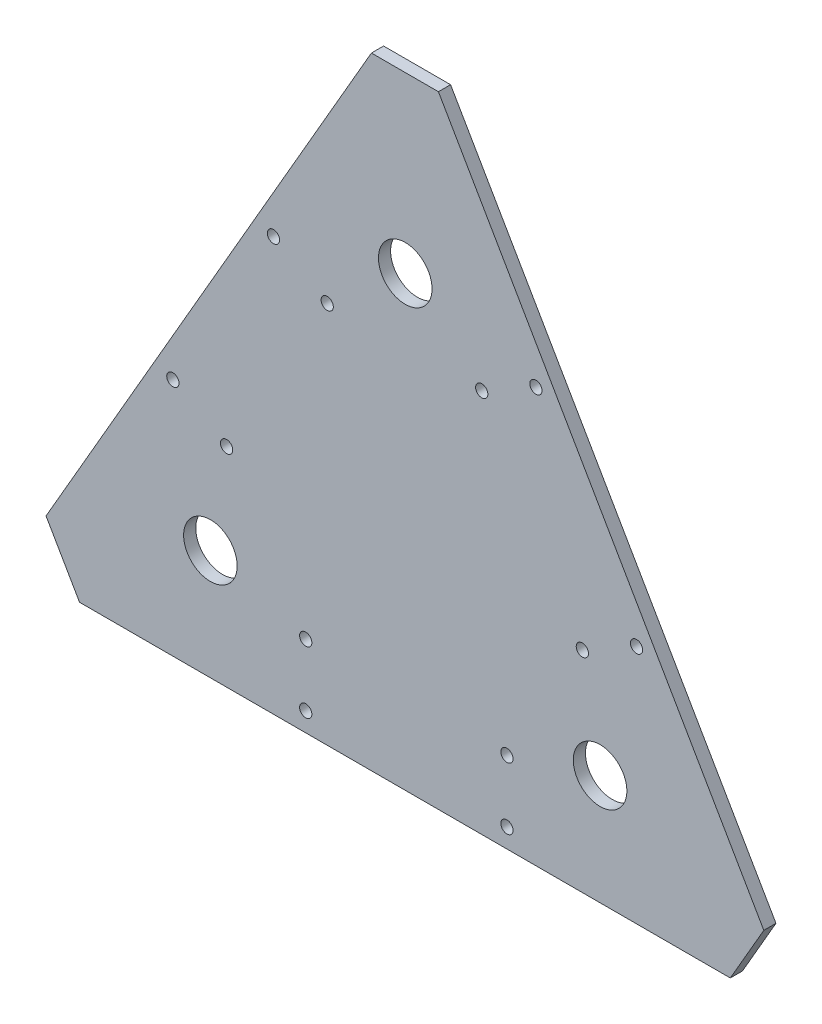
ISO-10303-21;
HEADER;
FILE_DESCRIPTION(('STEP AP214'),'2;1');
FILE_NAME('part.step','',(''),(''),'','','');
FILE_SCHEMA(('AUTOMOTIVE_DESIGN { 1 0 10303 214 1 1 1 1 }'));
ENDSEC;
DATA;
#1=APPLICATION_CONTEXT('core data for automotive mechanical design processes');
#2=APPLICATION_PROTOCOL_DEFINITION('international standard','automotive_design',2000,#1);
#3=PRODUCT_CONTEXT('',#1,'mechanical');
#4=PRODUCT('Part','Part','',(#3));
#5=PRODUCT_RELATED_PRODUCT_CATEGORY('part','',(#4));
#6=PRODUCT_DEFINITION_FORMATION('','',#4);
#7=PRODUCT_DEFINITION_CONTEXT('part definition',#1,'design');
#8=PRODUCT_DEFINITION('design','',#6,#7);
#9=PRODUCT_DEFINITION_SHAPE('','',#8);
#10=(LENGTH_UNIT() NAMED_UNIT(*) SI_UNIT(.MILLI.,.METRE.));
#11=(NAMED_UNIT(*) PLANE_ANGLE_UNIT() SI_UNIT($,.RADIAN.));
#12=(NAMED_UNIT(*) SI_UNIT($,.STERADIAN.) SOLID_ANGLE_UNIT());
#13=UNCERTAINTY_MEASURE_WITH_UNIT(LENGTH_MEASURE(1.E-05),#10,'distance_accuracy_value','');
#14=(GEOMETRIC_REPRESENTATION_CONTEXT(3) GLOBAL_UNCERTAINTY_ASSIGNED_CONTEXT((#13)) GLOBAL_UNIT_ASSIGNED_CONTEXT((#10,
#11,#12)) REPRESENTATION_CONTEXT('',''));
#15=CARTESIAN_POINT('',(0.,0.,0.));
#16=DIRECTION('',(0.,0.,1.));
#17=DIRECTION('',(1.,0.,0.));
#18=AXIS2_PLACEMENT_3D('',#15,#16,#17);
#19=CARTESIAN_POINT('',(-629.960250444117,-347.93042966675,-6.35));
#20=DIRECTION('',(-0.866025403784439,-0.499999999999999,0.));
#21=DIRECTION('',(0.499999999999999,-0.866025403784439,0.));
#22=AXIS2_PLACEMENT_3D('',#19,#20,#21);
#23=PLANE('',#22);
#24=DIRECTION('',(0.499999999999999,-0.866025403784439,0.));
#25=VECTOR('',#24,1.);
#26=CARTESIAN_POINT('',(-629.960250444117,-347.93042966675,0.));
#27=LINE('',#26,#25);
#28=CARTESIAN_POINT('',(-647.460250444117,-317.619540534295,0.));
#29=VERTEX_POINT('',#28);
#30=CARTESIAN_POINT('',(-629.960250444117,-347.93042966675,0.));
#31=VERTEX_POINT('',#30);
#32=EDGE_CURVE('E119',#29,#31,#27,.T.);
#33=ORIENTED_EDGE('',*,*,#32,.F.);
#34=DIRECTION('',(0.,0.,1.));
#35=VECTOR('',#34,1.);
#36=CARTESIAN_POINT('',(-647.460250444117,-317.619540534295,-6.35));
#37=LINE('',#36,#35);
#38=CARTESIAN_POINT('',(-647.460250444117,-317.619540534295,-6.35));
#39=VERTEX_POINT('',#38);
#40=EDGE_CURVE('E11',#39,#29,#37,.T.);
#41=ORIENTED_EDGE('',*,*,#40,.F.);
#42=DIRECTION('',(0.499999999999999,-0.866025403784439,0.));
#43=VECTOR('',#42,1.);
#44=CARTESIAN_POINT('',(-629.960250444117,-347.93042966675,-6.35));
#45=LINE('',#44,#43);
#46=CARTESIAN_POINT('',(-629.960250444117,-347.93042966675,-6.35));
#47=VERTEX_POINT('',#46);
#48=EDGE_CURVE('E134',#39,#47,#45,.T.);
#49=ORIENTED_EDGE('',*,*,#48,.T.);
#50=DIRECTION('',(0.,0.,1.));
#51=VECTOR('',#50,1.);
#52=CARTESIAN_POINT('',(-629.960250444117,-347.93042966675,-6.35));
#53=LINE('',#52,#51);
#54=EDGE_CURVE('E37',#47,#31,#53,.T.);
#55=ORIENTED_EDGE('',*,*,#54,.T.);
#56=EDGE_LOOP('',(#33,#41,#49,#55));
#57=FACE_BOUND('',#56,.T.);
#58=ADVANCED_FACE('F34',(#57),#23,.T.);
#59=CARTESIAN_POINT('',(-647.460250444117,-317.619540534295,-6.35));
#60=DIRECTION('',(-0.866025403784436,0.500000000000004,0.));
#61=DIRECTION('',(-0.500000000000004,-0.866025403784436,0.));
#62=AXIS2_PLACEMENT_3D('',#59,#60,#61);
#63=PLANE('',#62);
#64=DIRECTION('',(-0.500000000000004,-0.866025403784436,0.));
#65=VECTOR('',#64,1.);
#66=CARTESIAN_POINT('',(-647.460250444117,-317.619540534295,0.));
#67=LINE('',#66,#65);
#68=CARTESIAN_POINT('',(-477.475995613577,-23.1981746810674,0.));
#69=VERTEX_POINT('',#68);
#70=EDGE_CURVE('E132',#69,#29,#67,.T.);
#71=ORIENTED_EDGE('',*,*,#70,.F.);
#72=DIRECTION('',(0.,0.,1.));
#73=VECTOR('',#72,1.);
#74=CARTESIAN_POINT('',(-477.475995613577,-23.1981746810674,-6.35));
#75=LINE('',#74,#73);
#76=CARTESIAN_POINT('',(-477.475995613577,-23.1981746810674,-6.35));
#77=VERTEX_POINT('',#76);
#78=EDGE_CURVE('E43',#77,#69,#75,.T.);
#79=ORIENTED_EDGE('',*,*,#78,.F.);
#80=DIRECTION('',(-0.500000000000004,-0.866025403784436,0.));
#81=VECTOR('',#80,1.);
#82=CARTESIAN_POINT('',(-647.460250444117,-317.619540534295,-6.35));
#83=LINE('',#82,#81);
#84=EDGE_CURVE('E109',#77,#39,#83,.T.);
#85=ORIENTED_EDGE('',*,*,#84,.T.);
#86=ORIENTED_EDGE('',*,*,#40,.T.);
#87=EDGE_LOOP('',(#71,#79,#85,#86));
#88=FACE_BOUND('',#87,.T.);
#89=ADVANCED_FACE('F142',(#88),#63,.T.);
#90=CARTESIAN_POINT('',(-477.475995613577,-23.1981746810674,-6.35));
#91=DIRECTION('',(0.,1.,0.));
#92=DIRECTION('',(0.,0.,1.));
#93=AXIS2_PLACEMENT_3D('',#90,#91,#92);
#94=PLANE('',#93);
#95=DIRECTION('',(-1.,0.,0.));
#96=VECTOR('',#95,1.);
#97=CARTESIAN_POINT('',(-477.475995613577,-23.1981746810674,0.));
#98=LINE('',#97,#96);
#99=CARTESIAN_POINT('',(-442.475995613577,-23.1981746810674,0.));
#100=VERTEX_POINT('',#99);
#101=EDGE_CURVE('E96',#100,#69,#98,.T.);
#102=ORIENTED_EDGE('',*,*,#101,.F.);
#103=DIRECTION('',(0.,0.,1.));
#104=VECTOR('',#103,1.);
#105=CARTESIAN_POINT('',(-442.475995613577,-23.1981746810674,-6.35));
#106=LINE('',#105,#104);
#107=CARTESIAN_POINT('',(-442.475995613577,-23.1981746810674,-6.35));
#108=VERTEX_POINT('',#107);
#109=EDGE_CURVE('E91',#108,#100,#106,.T.);
#110=ORIENTED_EDGE('',*,*,#109,.F.);
#111=DIRECTION('',(-1.,0.,0.));
#112=VECTOR('',#111,1.);
#113=CARTESIAN_POINT('',(-477.475995613577,-23.1981746810674,-6.35));
#114=LINE('',#113,#112);
#115=EDGE_CURVE('E94',#108,#77,#114,.T.);
#116=ORIENTED_EDGE('',*,*,#115,.T.);
#117=ORIENTED_EDGE('',*,*,#78,.T.);
#118=EDGE_LOOP('',(#102,#110,#116,#117));
#119=FACE_BOUND('',#118,.T.);
#120=ADVANCED_FACE('F93',(#119),#94,.T.);
#121=CARTESIAN_POINT('',(-442.475995613577,-23.1981746810674,-6.35));
#122=DIRECTION('',(0.866025403784439,0.5,0.));
#123=DIRECTION('',(-0.5,0.866025403784439,0.));
#124=AXIS2_PLACEMENT_3D('',#121,#122,#123);
#125=PLANE('',#124);
#126=DIRECTION('',(-0.5,0.866025403784439,0.));
#127=VECTOR('',#126,1.);
#128=CARTESIAN_POINT('',(-442.475995613577,-23.1981746810674,0.));
#129=LINE('',#128,#127);
#130=CARTESIAN_POINT('',(-272.491740783038,-317.619540534296,0.));
#131=VERTEX_POINT('',#130);
#132=EDGE_CURVE('E129',#131,#100,#129,.T.);
#133=ORIENTED_EDGE('',*,*,#132,.F.);
#134=DIRECTION('',(0.,0.,1.));
#135=VECTOR('',#134,1.);
#136=CARTESIAN_POINT('',(-272.491740783038,-317.619540534296,-6.35));
#137=LINE('',#136,#135);
#138=CARTESIAN_POINT('',(-272.491740783038,-317.619540534296,-6.35));
#139=VERTEX_POINT('',#138);
#140=EDGE_CURVE('E101',#139,#131,#137,.T.);
#141=ORIENTED_EDGE('',*,*,#140,.F.);
#142=DIRECTION('',(-0.5,0.866025403784439,0.));
#143=VECTOR('',#142,1.);
#144=CARTESIAN_POINT('',(-442.475995613577,-23.1981746810674,-6.35));
#145=LINE('',#144,#143);
#146=EDGE_CURVE('E107',#139,#108,#145,.T.);
#147=ORIENTED_EDGE('',*,*,#146,.T.);
#148=ORIENTED_EDGE('',*,*,#109,.T.);
#149=EDGE_LOOP('',(#133,#141,#147,#148));
#150=FACE_BOUND('',#149,.T.);
#151=ADVANCED_FACE('F111',(#150),#125,.T.);
#152=CARTESIAN_POINT('',(-272.491740783038,-317.619540534296,-6.35));
#153=DIRECTION('',(0.866025403784416,-0.50000000000004,0.));
#154=DIRECTION('',(0.50000000000004,0.866025403784416,0.));
#155=AXIS2_PLACEMENT_3D('',#152,#153,#154);
#156=PLANE('',#155);
#157=DIRECTION('',(0.50000000000004,0.866025403784416,0.));
#158=VECTOR('',#157,1.);
#159=CARTESIAN_POINT('',(-272.491740783038,-317.619540534296,0.));
#160=LINE('',#159,#158);
#161=CARTESIAN_POINT('',(-289.99174078304,-347.93042966675,0.));
#162=VERTEX_POINT('',#161);
#163=EDGE_CURVE('E126',#162,#131,#160,.T.);
#164=ORIENTED_EDGE('',*,*,#163,.F.);
#165=DIRECTION('',(0.,0.,1.));
#166=VECTOR('',#165,1.);
#167=CARTESIAN_POINT('',(-289.99174078304,-347.93042966675,-6.35));
#168=LINE('',#167,#166);
#169=CARTESIAN_POINT('',(-289.99174078304,-347.93042966675,-6.35));
#170=VERTEX_POINT('',#169);
#171=EDGE_CURVE('E137',#170,#162,#168,.T.);
#172=ORIENTED_EDGE('',*,*,#171,.F.);
#173=DIRECTION('',(0.50000000000004,0.866025403784416,0.));
#174=VECTOR('',#173,1.);
#175=CARTESIAN_POINT('',(-272.491740783038,-317.619540534296,-6.35));
#176=LINE('',#175,#174);
#177=EDGE_CURVE('E112',#170,#139,#176,.T.);
#178=ORIENTED_EDGE('',*,*,#177,.T.);
#179=ORIENTED_EDGE('',*,*,#140,.T.);
#180=EDGE_LOOP('',(#164,#172,#178,#179));
#181=FACE_BOUND('',#180,.T.);
#182=ADVANCED_FACE('F155',(#181),#156,.T.);
#183=CARTESIAN_POINT('',(-289.99174078304,-347.93042966675,-6.35));
#184=DIRECTION('',(0.,-1.,0.));
#185=DIRECTION('',(0.,0.,-1.));
#186=AXIS2_PLACEMENT_3D('',#183,#184,#185);
#187=PLANE('',#186);
#188=DIRECTION('',(1.,0.,0.));
#189=VECTOR('',#188,1.);
#190=CARTESIAN_POINT('',(-289.99174078304,-347.93042966675,0.));
#191=LINE('',#190,#189);
#192=EDGE_CURVE('E122',#31,#162,#191,.T.);
#193=ORIENTED_EDGE('',*,*,#192,.F.);
#194=ORIENTED_EDGE('',*,*,#54,.F.);
#195=DIRECTION('',(1.,0.,0.));
#196=VECTOR('',#195,1.);
#197=CARTESIAN_POINT('',(-289.99174078304,-347.93042966675,-6.35));
#198=LINE('',#197,#196);
#199=EDGE_CURVE('E114',#47,#170,#198,.T.);
#200=ORIENTED_EDGE('',*,*,#199,.T.);
#201=ORIENTED_EDGE('',*,*,#171,.T.);
#202=EDGE_LOOP('',(#193,#194,#200,#201));
#203=FACE_BOUND('',#202,.T.);
#204=ADVANCED_FACE('F139',(#203),#187,.T.);
#205=CARTESIAN_POINT('',(0.,0.,-6.35));
#206=DIRECTION('',(0.,0.,-1.));
#207=DIRECTION('',(-1.,0.,0.));
#208=AXIS2_PLACEMENT_3D('',#205,#206,#207);
#209=PLANE('',#208);
#210=CARTESIAN_POINT('',(-561.593450547266,-290.351876517457,-6.35));
#211=DIRECTION('',(0.,0.,1.));
#212=DIRECTION('',(1.,0.,0.));
#213=AXIS2_PLACEMENT_3D('',#210,#211,#212);
#214=CIRCLE('',#213,14.);
#215=CARTESIAN_POINT('',(-547.593450547266,-290.351876517457,-6.35));
#216=VERTEX_POINT('',#215);
#217=EDGE_CURVE('E233',#216,#216,#214,.T.);
#218=ORIENTED_EDGE('',*,*,#217,.T.);
#219=EDGE_LOOP('',(#218));
#220=FACE_BOUND('',#219,.T.);
#221=CARTESIAN_POINT('',(-358.022290508475,-290.351876517456,-6.35));
#222=DIRECTION('',(0.,0.,1.));
#223=DIRECTION('',(1.,0.,0.));
#224=AXIS2_PLACEMENT_3D('',#221,#222,#223);
#225=CIRCLE('',#224,14.0000000000001);
#226=CARTESIAN_POINT('',(-344.022290508475,-290.351876517456,-6.35));
#227=VERTEX_POINT('',#226);
#228=EDGE_CURVE('E241',#227,#227,#225,.T.);
#229=ORIENTED_EDGE('',*,*,#228,.T.);
#230=EDGE_LOOP('',(#229));
#231=FACE_BOUND('',#230,.T.);
#232=CARTESIAN_POINT('',(-459.807870527873,-114.054080445996,-6.35));
#233=DIRECTION('',(0.,0.,1.));
#234=DIRECTION('',(1.,0.,0.));
#235=AXIS2_PLACEMENT_3D('',#232,#233,#234);
#236=CIRCLE('',#235,14.);
#237=CARTESIAN_POINT('',(-445.807870527873,-114.054080445996,-6.35));
#238=VERTEX_POINT('',#237);
#239=EDGE_CURVE('E247',#238,#238,#236,.T.);
#240=ORIENTED_EDGE('',*,*,#239,.T.);
#241=EDGE_LOOP('',(#240));
#242=FACE_BOUND('',#241,.T.);
#243=CARTESIAN_POINT('',(-406.680508256034,-305.530429666979,-6.35));
#244=DIRECTION('',(0.,0.,1.));
#245=DIRECTION('',(1.,0.,0.));
#246=AXIS2_PLACEMENT_3D('',#243,#244,#245);
#247=CIRCLE('',#246,3.19999999999998);
#248=CARTESIAN_POINT('',(-403.480508256035,-305.530429666979,-6.35));
#249=VERTEX_POINT('',#248);
#250=EDGE_CURVE('E253',#249,#249,#247,.T.);
#251=ORIENTED_EDGE('',*,*,#250,.T.);
#252=EDGE_LOOP('',(#251));
#253=FACE_BOUND('',#252,.T.);
#254=CARTESIAN_POINT('',(-511.800751787237,-305.530429666979,-6.35));
#255=DIRECTION('',(0.,0.,1.));
#256=DIRECTION('',(1.,0.,0.));
#257=AXIS2_PLACEMENT_3D('',#254,#255,#256);
#258=CIRCLE('',#257,3.19999999999992);
#259=CARTESIAN_POINT('',(-508.600751787237,-305.530429666979,-6.35));
#260=VERTEX_POINT('',#259);
#261=EDGE_CURVE('E259',#260,#260,#258,.T.);
#262=ORIENTED_EDGE('',*,*,#261,.T.);
#263=EDGE_LOOP('',(#262));
#264=FACE_BOUND('',#263,.T.);
#265=CARTESIAN_POINT('',(-511.800630021636,-337.93042966675,-6.35));
#266=DIRECTION('',(0.,0.,1.));
#267=DIRECTION('',(1.,0.,0.));
#268=AXIS2_PLACEMENT_3D('',#265,#266,#267);
#269=CIRCLE('',#268,3.19999999999992);
#270=CARTESIAN_POINT('',(-508.600630021636,-337.93042966675,-6.35));
#271=VERTEX_POINT('',#270);
#272=EDGE_CURVE('E265',#271,#271,#269,.T.);
#273=ORIENTED_EDGE('',*,*,#272,.T.);
#274=EDGE_LOOP('',(#273));
#275=FACE_BOUND('',#274,.T.);
#276=CARTESIAN_POINT('',(-406.680630021636,-337.93042966675,-6.35));
#277=DIRECTION('',(0.,0.,1.));
#278=DIRECTION('',(1.,0.,0.));
#279=AXIS2_PLACEMENT_3D('',#276,#277,#278);
#280=CIRCLE('',#279,3.19999999999998);
#281=CARTESIAN_POINT('',(-403.480630021636,-337.93042966675,-6.35));
#282=VERTEX_POINT('',#281);
#283=EDGE_CURVE('E271',#282,#282,#280,.T.);
#284=ORIENTED_EDGE('',*,*,#283,.T.);
#285=EDGE_LOOP('',(#284));
#286=FACE_BOUND('',#285,.T.);
#287=CARTESIAN_POINT('',(-419.854158493872,-147.172464107159,-6.35));
#288=DIRECTION('',(0.,0.,1.));
#289=DIRECTION('',(1.,0.,0.));
#290=AXIS2_PLACEMENT_3D('',#287,#288,#289);
#291=CIRCLE('',#290,3.19999999999999);
#292=CARTESIAN_POINT('',(-416.654158493872,-147.172464107159,-6.35));
#293=VERTEX_POINT('',#292);
#294=EDGE_CURVE('E277',#293,#293,#291,.T.);
#295=ORIENTED_EDGE('',*,*,#294,.T.);
#296=EDGE_LOOP('',(#295));
#297=FACE_BOUND('',#296,.T.);
#298=CARTESIAN_POINT('',(-367.294158493872,-238.20905455298,-6.35));
#299=DIRECTION('',(0.,0.,1.));
#300=DIRECTION('',(1.,0.,0.));
#301=AXIS2_PLACEMENT_3D('',#298,#299,#300);
#302=CIRCLE('',#301,3.19999999999999);
#303=CARTESIAN_POINT('',(-364.094158493872,-238.20905455298,-6.35));
#304=VERTEX_POINT('',#303);
#305=EDGE_CURVE('E283',#304,#304,#302,.T.);
#306=ORIENTED_EDGE('',*,*,#305,.T.);
#307=EDGE_LOOP('',(#306));
#308=FACE_BOUND('',#307,.T.);
#309=CARTESIAN_POINT('',(-338.985684719404,-222.448651240874,-6.35));
#310=DIRECTION('',(0.,0.,1.));
#311=DIRECTION('',(1.,0.,0.));
#312=AXIS2_PLACEMENT_3D('',#309,#310,#311);
#313=CIRCLE('',#312,3.19999999999999);
#314=CARTESIAN_POINT('',(-335.785684719404,-222.448651240874,-6.35));
#315=VERTEX_POINT('',#314);
#316=EDGE_CURVE('E289',#315,#315,#313,.T.);
#317=ORIENTED_EDGE('',*,*,#316,.T.);
#318=EDGE_LOOP('',(#317));
#319=FACE_BOUND('',#318,.T.);
#320=CARTESIAN_POINT('',(-391.545684719404,-131.412060795054,-6.35));
#321=DIRECTION('',(0.,0.,1.));
#322=DIRECTION('',(1.,0.,0.));
#323=AXIS2_PLACEMENT_3D('',#320,#321,#322);
#324=CIRCLE('',#323,3.19999999999999);
#325=CARTESIAN_POINT('',(-388.345684719404,-131.412060795054,-6.35));
#326=VERTEX_POINT('',#325);
#327=EDGE_CURVE('E295',#326,#326,#324,.T.);
#328=ORIENTED_EDGE('',*,*,#327,.T.);
#329=EDGE_LOOP('',(#328));
#330=FACE_BOUND('',#329,.T.);
#331=CARTESIAN_POINT('',(-553.136815612523,-239.046537701711,-6.35));
#332=DIRECTION('',(0.,0.,1.));
#333=DIRECTION('',(1.,0.,0.));
#334=AXIS2_PLACEMENT_3D('',#331,#332,#333);
#335=CIRCLE('',#334,3.19999999999992);
#336=CARTESIAN_POINT('',(-549.936815612523,-239.046537701711,-6.35));
#337=VERTEX_POINT('',#336);
#338=EDGE_CURVE('E301',#337,#337,#335,.T.);
#339=ORIENTED_EDGE('',*,*,#338,.T.);
#340=EDGE_LOOP('',(#339));
#341=FACE_BOUND('',#340,.T.);
#342=CARTESIAN_POINT('',(-500.577727614793,-148.011529753204,-6.35));
#343=DIRECTION('',(0.,0.,1.));
#344=DIRECTION('',(1.,0.,0.));
#345=AXIS2_PLACEMENT_3D('',#342,#343,#344);
#346=CIRCLE('',#345,3.20000000000004);
#347=CARTESIAN_POINT('',(-497.377727614793,-148.011529753204,-6.35));
#348=VERTEX_POINT('',#347);
#349=EDGE_CURVE('E307',#348,#348,#346,.T.);
#350=ORIENTED_EDGE('',*,*,#349,.T.);
#351=EDGE_LOOP('',(#350));
#352=FACE_BOUND('',#351,.T.);
#353=CARTESIAN_POINT('',(-528.64918295323,-131.832735138585,-6.35));
#354=DIRECTION('',(0.,0.,1.));
#355=DIRECTION('',(1.,0.,0.));
#356=AXIS2_PLACEMENT_3D('',#353,#354,#355);
#357=CIRCLE('',#356,3.19999999999993);
#358=CARTESIAN_POINT('',(-525.44918295323,-131.832735138585,-6.35));
#359=VERTEX_POINT('',#358);
#360=EDGE_CURVE('E313',#359,#359,#357,.T.);
#361=ORIENTED_EDGE('',*,*,#360,.T.);
#362=EDGE_LOOP('',(#361));
#363=FACE_BOUND('',#362,.T.);
#364=CARTESIAN_POINT('',(-581.20918295323,-222.869325584405,-6.35));
#365=DIRECTION('',(0.,0.,1.));
#366=DIRECTION('',(1.,0.,0.));
#367=AXIS2_PLACEMENT_3D('',#364,#365,#366);
#368=CIRCLE('',#367,3.20000000000005);
#369=CARTESIAN_POINT('',(-578.00918295323,-222.869325584405,-6.35));
#370=VERTEX_POINT('',#369);
#371=EDGE_CURVE('E123',#370,#370,#368,.T.);
#372=ORIENTED_EDGE('',*,*,#371,.T.);
#373=EDGE_LOOP('',(#372));
#374=FACE_BOUND('',#373,.T.);
#375=ORIENTED_EDGE('',*,*,#48,.F.);
#376=ORIENTED_EDGE('',*,*,#84,.F.);
#377=ORIENTED_EDGE('',*,*,#115,.F.);
#378=ORIENTED_EDGE('',*,*,#146,.F.);
#379=ORIENTED_EDGE('',*,*,#177,.F.);
#380=ORIENTED_EDGE('',*,*,#199,.F.);
#381=EDGE_LOOP('',(#375,#376,#377,#378,#379,#380));
#382=FACE_BOUND('',#381,.T.);
#383=ADVANCED_FACE('F105',(#220,#231,#242,#253,#264,#275,#286,#297,#308,#319,#330,#341,#352,
#363,#374,#382),#209,.T.);
#384=CARTESIAN_POINT('',(0.,0.,0.));
#385=DIRECTION('',(0.,0.,-1.));
#386=DIRECTION('',(-1.,0.,0.));
#387=AXIS2_PLACEMENT_3D('',#384,#385,#386);
#388=PLANE('',#387);
#389=CARTESIAN_POINT('',(-561.593450547266,-290.351876517457,0.));
#390=DIRECTION('',(0.,0.,1.));
#391=DIRECTION('',(1.,0.,0.));
#392=AXIS2_PLACEMENT_3D('',#389,#390,#391);
#393=CIRCLE('',#392,14.);
#394=CARTESIAN_POINT('',(-547.593450547266,-290.351876517457,0.));
#395=VERTEX_POINT('',#394);
#396=EDGE_CURVE('E236',#395,#395,#393,.T.);
#397=ORIENTED_EDGE('',*,*,#396,.F.);
#398=EDGE_LOOP('',(#397));
#399=FACE_BOUND('',#398,.T.);
#400=CARTESIAN_POINT('',(-358.022290508475,-290.351876517456,0.));
#401=DIRECTION('',(0.,0.,1.));
#402=DIRECTION('',(1.,0.,0.));
#403=AXIS2_PLACEMENT_3D('',#400,#401,#402);
#404=CIRCLE('',#403,14.0000000000001);
#405=CARTESIAN_POINT('',(-344.022290508475,-290.351876517456,0.));
#406=VERTEX_POINT('',#405);
#407=EDGE_CURVE('E238',#406,#406,#404,.T.);
#408=ORIENTED_EDGE('',*,*,#407,.F.);
#409=EDGE_LOOP('',(#408));
#410=FACE_BOUND('',#409,.T.);
#411=CARTESIAN_POINT('',(-459.807870527873,-114.054080445996,0.));
#412=DIRECTION('',(0.,0.,1.));
#413=DIRECTION('',(1.,0.,0.));
#414=AXIS2_PLACEMENT_3D('',#411,#412,#413);
#415=CIRCLE('',#414,14.);
#416=CARTESIAN_POINT('',(-445.807870527873,-114.054080445996,0.));
#417=VERTEX_POINT('',#416);
#418=EDGE_CURVE('E244',#417,#417,#415,.T.);
#419=ORIENTED_EDGE('',*,*,#418,.F.);
#420=EDGE_LOOP('',(#419));
#421=FACE_BOUND('',#420,.T.);
#422=CARTESIAN_POINT('',(-406.680508256034,-305.530429666979,0.));
#423=DIRECTION('',(0.,0.,1.));
#424=DIRECTION('',(1.,0.,0.));
#425=AXIS2_PLACEMENT_3D('',#422,#423,#424);
#426=CIRCLE('',#425,3.19999999999998);
#427=CARTESIAN_POINT('',(-403.480508256035,-305.530429666979,0.));
#428=VERTEX_POINT('',#427);
#429=EDGE_CURVE('E250',#428,#428,#426,.T.);
#430=ORIENTED_EDGE('',*,*,#429,.F.);
#431=EDGE_LOOP('',(#430));
#432=FACE_BOUND('',#431,.T.);
#433=CARTESIAN_POINT('',(-511.800751787237,-305.530429666979,0.));
#434=DIRECTION('',(0.,0.,1.));
#435=DIRECTION('',(1.,0.,0.));
#436=AXIS2_PLACEMENT_3D('',#433,#434,#435);
#437=CIRCLE('',#436,3.19999999999992);
#438=CARTESIAN_POINT('',(-508.600751787237,-305.530429666979,0.));
#439=VERTEX_POINT('',#438);
#440=EDGE_CURVE('E256',#439,#439,#437,.T.);
#441=ORIENTED_EDGE('',*,*,#440,.F.);
#442=EDGE_LOOP('',(#441));
#443=FACE_BOUND('',#442,.T.);
#444=CARTESIAN_POINT('',(-511.800630021636,-337.93042966675,0.));
#445=DIRECTION('',(0.,0.,1.));
#446=DIRECTION('',(1.,0.,0.));
#447=AXIS2_PLACEMENT_3D('',#444,#445,#446);
#448=CIRCLE('',#447,3.19999999999992);
#449=CARTESIAN_POINT('',(-508.600630021636,-337.93042966675,0.));
#450=VERTEX_POINT('',#449);
#451=EDGE_CURVE('E262',#450,#450,#448,.T.);
#452=ORIENTED_EDGE('',*,*,#451,.F.);
#453=EDGE_LOOP('',(#452));
#454=FACE_BOUND('',#453,.T.);
#455=CARTESIAN_POINT('',(-406.680630021636,-337.93042966675,0.));
#456=DIRECTION('',(0.,0.,1.));
#457=DIRECTION('',(1.,0.,0.));
#458=AXIS2_PLACEMENT_3D('',#455,#456,#457);
#459=CIRCLE('',#458,3.19999999999998);
#460=CARTESIAN_POINT('',(-403.480630021636,-337.93042966675,0.));
#461=VERTEX_POINT('',#460);
#462=EDGE_CURVE('E268',#461,#461,#459,.T.);
#463=ORIENTED_EDGE('',*,*,#462,.F.);
#464=EDGE_LOOP('',(#463));
#465=FACE_BOUND('',#464,.T.);
#466=CARTESIAN_POINT('',(-419.854158493872,-147.172464107159,0.));
#467=DIRECTION('',(0.,0.,1.));
#468=DIRECTION('',(1.,0.,0.));
#469=AXIS2_PLACEMENT_3D('',#466,#467,#468);
#470=CIRCLE('',#469,3.19999999999999);
#471=CARTESIAN_POINT('',(-416.654158493872,-147.172464107159,0.));
#472=VERTEX_POINT('',#471);
#473=EDGE_CURVE('E274',#472,#472,#470,.T.);
#474=ORIENTED_EDGE('',*,*,#473,.F.);
#475=EDGE_LOOP('',(#474));
#476=FACE_BOUND('',#475,.T.);
#477=CARTESIAN_POINT('',(-367.294158493872,-238.20905455298,0.));
#478=DIRECTION('',(0.,0.,1.));
#479=DIRECTION('',(1.,0.,0.));
#480=AXIS2_PLACEMENT_3D('',#477,#478,#479);
#481=CIRCLE('',#480,3.19999999999999);
#482=CARTESIAN_POINT('',(-364.094158493872,-238.20905455298,0.));
#483=VERTEX_POINT('',#482);
#484=EDGE_CURVE('E280',#483,#483,#481,.T.);
#485=ORIENTED_EDGE('',*,*,#484,.F.);
#486=EDGE_LOOP('',(#485));
#487=FACE_BOUND('',#486,.T.);
#488=CARTESIAN_POINT('',(-338.985684719404,-222.448651240874,0.));
#489=DIRECTION('',(0.,0.,1.));
#490=DIRECTION('',(1.,0.,0.));
#491=AXIS2_PLACEMENT_3D('',#488,#489,#490);
#492=CIRCLE('',#491,3.19999999999999);
#493=CARTESIAN_POINT('',(-335.785684719404,-222.448651240874,0.));
#494=VERTEX_POINT('',#493);
#495=EDGE_CURVE('E286',#494,#494,#492,.T.);
#496=ORIENTED_EDGE('',*,*,#495,.F.);
#497=EDGE_LOOP('',(#496));
#498=FACE_BOUND('',#497,.T.);
#499=CARTESIAN_POINT('',(-391.545684719404,-131.412060795054,0.));
#500=DIRECTION('',(0.,0.,1.));
#501=DIRECTION('',(1.,0.,0.));
#502=AXIS2_PLACEMENT_3D('',#499,#500,#501);
#503=CIRCLE('',#502,3.19999999999999);
#504=CARTESIAN_POINT('',(-388.345684719404,-131.412060795054,0.));
#505=VERTEX_POINT('',#504);
#506=EDGE_CURVE('E292',#505,#505,#503,.T.);
#507=ORIENTED_EDGE('',*,*,#506,.F.);
#508=EDGE_LOOP('',(#507));
#509=FACE_BOUND('',#508,.T.);
#510=CARTESIAN_POINT('',(-553.136815612523,-239.046537701711,0.));
#511=DIRECTION('',(0.,0.,1.));
#512=DIRECTION('',(1.,0.,0.));
#513=AXIS2_PLACEMENT_3D('',#510,#511,#512);
#514=CIRCLE('',#513,3.19999999999992);
#515=CARTESIAN_POINT('',(-549.936815612523,-239.046537701711,0.));
#516=VERTEX_POINT('',#515);
#517=EDGE_CURVE('E298',#516,#516,#514,.T.);
#518=ORIENTED_EDGE('',*,*,#517,.F.);
#519=EDGE_LOOP('',(#518));
#520=FACE_BOUND('',#519,.T.);
#521=CARTESIAN_POINT('',(-500.577727614793,-148.011529753204,0.));
#522=DIRECTION('',(0.,0.,1.));
#523=DIRECTION('',(1.,0.,0.));
#524=AXIS2_PLACEMENT_3D('',#521,#522,#523);
#525=CIRCLE('',#524,3.20000000000004);
#526=CARTESIAN_POINT('',(-497.377727614793,-148.011529753204,0.));
#527=VERTEX_POINT('',#526);
#528=EDGE_CURVE('E304',#527,#527,#525,.T.);
#529=ORIENTED_EDGE('',*,*,#528,.F.);
#530=EDGE_LOOP('',(#529));
#531=FACE_BOUND('',#530,.T.);
#532=CARTESIAN_POINT('',(-528.64918295323,-131.832735138585,0.));
#533=DIRECTION('',(0.,0.,1.));
#534=DIRECTION('',(1.,0.,0.));
#535=AXIS2_PLACEMENT_3D('',#532,#533,#534);
#536=CIRCLE('',#535,3.19999999999993);
#537=CARTESIAN_POINT('',(-525.44918295323,-131.832735138585,0.));
#538=VERTEX_POINT('',#537);
#539=EDGE_CURVE('E310',#538,#538,#536,.T.);
#540=ORIENTED_EDGE('',*,*,#539,.F.);
#541=EDGE_LOOP('',(#540));
#542=FACE_BOUND('',#541,.T.);
#543=CARTESIAN_POINT('',(-581.20918295323,-222.869325584405,0.));
#544=DIRECTION('',(0.,0.,1.));
#545=DIRECTION('',(1.,0.,0.));
#546=AXIS2_PLACEMENT_3D('',#543,#544,#545);
#547=CIRCLE('',#546,3.20000000000005);
#548=CARTESIAN_POINT('',(-578.00918295323,-222.869325584405,0.));
#549=VERTEX_POINT('',#548);
#550=EDGE_CURVE('E316',#549,#549,#547,.T.);
#551=ORIENTED_EDGE('',*,*,#550,.F.);
#552=EDGE_LOOP('',(#551));
#553=FACE_BOUND('',#552,.T.);
#554=ORIENTED_EDGE('',*,*,#32,.T.);
#555=ORIENTED_EDGE('',*,*,#192,.T.);
#556=ORIENTED_EDGE('',*,*,#163,.T.);
#557=ORIENTED_EDGE('',*,*,#132,.T.);
#558=ORIENTED_EDGE('',*,*,#101,.T.);
#559=ORIENTED_EDGE('',*,*,#70,.T.);
#560=EDGE_LOOP('',(#554,#555,#556,#557,#558,#559));
#561=FACE_BOUND('',#560,.T.);
#562=ADVANCED_FACE('F141',(#399,#410,#421,#432,#443,#454,#465,#476,#487,#498,#509,#520,#531,
#542,#553,#561),#388,.F.);
#563=CARTESIAN_POINT('',(-581.20918295323,-222.869325584405,-6.35));
#564=DIRECTION('',(0.,0.,1.));
#565=DIRECTION('',(1.,0.,0.));
#566=AXIS2_PLACEMENT_3D('',#563,#564,#565);
#567=CYLINDRICAL_SURFACE('',#566,3.20000000000005);
#568=ORIENTED_EDGE('',*,*,#371,.F.);
#569=EDGE_LOOP('',(#568));
#570=FACE_BOUND('',#569,.T.);
#571=ORIENTED_EDGE('',*,*,#550,.T.);
#572=EDGE_LOOP('',(#571));
#573=FACE_BOUND('',#572,.T.);
#574=ADVANCED_FACE('F166',(#570,#573),#567,.F.);
#575=CARTESIAN_POINT('',(-528.64918295323,-131.832735138585,-6.35));
#576=DIRECTION('',(0.,0.,1.));
#577=DIRECTION('',(1.,0.,0.));
#578=AXIS2_PLACEMENT_3D('',#575,#576,#577);
#579=CYLINDRICAL_SURFACE('',#578,3.19999999999993);
#580=ORIENTED_EDGE('',*,*,#360,.F.);
#581=EDGE_LOOP('',(#580));
#582=FACE_BOUND('',#581,.T.);
#583=ORIENTED_EDGE('',*,*,#539,.T.);
#584=EDGE_LOOP('',(#583));
#585=FACE_BOUND('',#584,.T.);
#586=ADVANCED_FACE('F173',(#582,#585),#579,.F.);
#587=CARTESIAN_POINT('',(-500.577727614793,-148.011529753204,-6.35));
#588=DIRECTION('',(0.,0.,1.));
#589=DIRECTION('',(1.,0.,0.));
#590=AXIS2_PLACEMENT_3D('',#587,#588,#589);
#591=CYLINDRICAL_SURFACE('',#590,3.20000000000004);
#592=ORIENTED_EDGE('',*,*,#349,.F.);
#593=EDGE_LOOP('',(#592));
#594=FACE_BOUND('',#593,.T.);
#595=ORIENTED_EDGE('',*,*,#528,.T.);
#596=EDGE_LOOP('',(#595));
#597=FACE_BOUND('',#596,.T.);
#598=ADVANCED_FACE('F177',(#594,#597),#591,.F.);
#599=CARTESIAN_POINT('',(-553.136815612523,-239.046537701711,-6.35));
#600=DIRECTION('',(0.,0.,1.));
#601=DIRECTION('',(1.,0.,0.));
#602=AXIS2_PLACEMENT_3D('',#599,#600,#601);
#603=CYLINDRICAL_SURFACE('',#602,3.19999999999992);
#604=ORIENTED_EDGE('',*,*,#338,.F.);
#605=EDGE_LOOP('',(#604));
#606=FACE_BOUND('',#605,.T.);
#607=ORIENTED_EDGE('',*,*,#517,.T.);
#608=EDGE_LOOP('',(#607));
#609=FACE_BOUND('',#608,.T.);
#610=ADVANCED_FACE('F181',(#606,#609),#603,.F.);
#611=CARTESIAN_POINT('',(-391.545684719404,-131.412060795054,-6.35));
#612=DIRECTION('',(0.,0.,1.));
#613=DIRECTION('',(1.,0.,0.));
#614=AXIS2_PLACEMENT_3D('',#611,#612,#613);
#615=CYLINDRICAL_SURFACE('',#614,3.19999999999999);
#616=ORIENTED_EDGE('',*,*,#327,.F.);
#617=EDGE_LOOP('',(#616));
#618=FACE_BOUND('',#617,.T.);
#619=ORIENTED_EDGE('',*,*,#506,.T.);
#620=EDGE_LOOP('',(#619));
#621=FACE_BOUND('',#620,.T.);
#622=ADVANCED_FACE('F185',(#618,#621),#615,.F.);
#623=CARTESIAN_POINT('',(-338.985684719404,-222.448651240874,-6.35));
#624=DIRECTION('',(0.,0.,1.));
#625=DIRECTION('',(1.,0.,0.));
#626=AXIS2_PLACEMENT_3D('',#623,#624,#625);
#627=CYLINDRICAL_SURFACE('',#626,3.19999999999999);
#628=ORIENTED_EDGE('',*,*,#316,.F.);
#629=EDGE_LOOP('',(#628));
#630=FACE_BOUND('',#629,.T.);
#631=ORIENTED_EDGE('',*,*,#495,.T.);
#632=EDGE_LOOP('',(#631));
#633=FACE_BOUND('',#632,.T.);
#634=ADVANCED_FACE('F189',(#630,#633),#627,.F.);
#635=CARTESIAN_POINT('',(-367.294158493872,-238.20905455298,-6.35));
#636=DIRECTION('',(0.,0.,1.));
#637=DIRECTION('',(1.,0.,0.));
#638=AXIS2_PLACEMENT_3D('',#635,#636,#637);
#639=CYLINDRICAL_SURFACE('',#638,3.19999999999999);
#640=ORIENTED_EDGE('',*,*,#305,.F.);
#641=EDGE_LOOP('',(#640));
#642=FACE_BOUND('',#641,.T.);
#643=ORIENTED_EDGE('',*,*,#484,.T.);
#644=EDGE_LOOP('',(#643));
#645=FACE_BOUND('',#644,.T.);
#646=ADVANCED_FACE('F193',(#642,#645),#639,.F.);
#647=CARTESIAN_POINT('',(-419.854158493872,-147.172464107159,-6.35));
#648=DIRECTION('',(0.,0.,1.));
#649=DIRECTION('',(1.,0.,0.));
#650=AXIS2_PLACEMENT_3D('',#647,#648,#649);
#651=CYLINDRICAL_SURFACE('',#650,3.19999999999999);
#652=ORIENTED_EDGE('',*,*,#294,.F.);
#653=EDGE_LOOP('',(#652));
#654=FACE_BOUND('',#653,.T.);
#655=ORIENTED_EDGE('',*,*,#473,.T.);
#656=EDGE_LOOP('',(#655));
#657=FACE_BOUND('',#656,.T.);
#658=ADVANCED_FACE('F197',(#654,#657),#651,.F.);
#659=CARTESIAN_POINT('',(-406.680630021636,-337.93042966675,-6.35));
#660=DIRECTION('',(0.,0.,1.));
#661=DIRECTION('',(1.,0.,0.));
#662=AXIS2_PLACEMENT_3D('',#659,#660,#661);
#663=CYLINDRICAL_SURFACE('',#662,3.19999999999998);
#664=ORIENTED_EDGE('',*,*,#283,.F.);
#665=EDGE_LOOP('',(#664));
#666=FACE_BOUND('',#665,.T.);
#667=ORIENTED_EDGE('',*,*,#462,.T.);
#668=EDGE_LOOP('',(#667));
#669=FACE_BOUND('',#668,.T.);
#670=ADVANCED_FACE('F201',(#666,#669),#663,.F.);
#671=CARTESIAN_POINT('',(-511.800630021636,-337.93042966675,-6.35));
#672=DIRECTION('',(0.,0.,1.));
#673=DIRECTION('',(1.,0.,0.));
#674=AXIS2_PLACEMENT_3D('',#671,#672,#673);
#675=CYLINDRICAL_SURFACE('',#674,3.19999999999992);
#676=ORIENTED_EDGE('',*,*,#272,.F.);
#677=EDGE_LOOP('',(#676));
#678=FACE_BOUND('',#677,.T.);
#679=ORIENTED_EDGE('',*,*,#451,.T.);
#680=EDGE_LOOP('',(#679));
#681=FACE_BOUND('',#680,.T.);
#682=ADVANCED_FACE('F205',(#678,#681),#675,.F.);
#683=CARTESIAN_POINT('',(-511.800751787237,-305.530429666979,-6.35));
#684=DIRECTION('',(0.,0.,1.));
#685=DIRECTION('',(1.,0.,0.));
#686=AXIS2_PLACEMENT_3D('',#683,#684,#685);
#687=CYLINDRICAL_SURFACE('',#686,3.19999999999992);
#688=ORIENTED_EDGE('',*,*,#261,.F.);
#689=EDGE_LOOP('',(#688));
#690=FACE_BOUND('',#689,.T.);
#691=ORIENTED_EDGE('',*,*,#440,.T.);
#692=EDGE_LOOP('',(#691));
#693=FACE_BOUND('',#692,.T.);
#694=ADVANCED_FACE('F209',(#690,#693),#687,.F.);
#695=CARTESIAN_POINT('',(-406.680508256034,-305.530429666979,-6.35));
#696=DIRECTION('',(0.,0.,1.));
#697=DIRECTION('',(1.,0.,0.));
#698=AXIS2_PLACEMENT_3D('',#695,#696,#697);
#699=CYLINDRICAL_SURFACE('',#698,3.19999999999998);
#700=ORIENTED_EDGE('',*,*,#250,.F.);
#701=EDGE_LOOP('',(#700));
#702=FACE_BOUND('',#701,.T.);
#703=ORIENTED_EDGE('',*,*,#429,.T.);
#704=EDGE_LOOP('',(#703));
#705=FACE_BOUND('',#704,.T.);
#706=ADVANCED_FACE('F213',(#702,#705),#699,.F.);
#707=CARTESIAN_POINT('',(-459.807870527873,-114.054080445996,-6.35));
#708=DIRECTION('',(0.,0.,1.));
#709=DIRECTION('',(1.,0.,0.));
#710=AXIS2_PLACEMENT_3D('',#707,#708,#709);
#711=CYLINDRICAL_SURFACE('',#710,14.);
#712=ORIENTED_EDGE('',*,*,#239,.F.);
#713=EDGE_LOOP('',(#712));
#714=FACE_BOUND('',#713,.T.);
#715=ORIENTED_EDGE('',*,*,#418,.T.);
#716=EDGE_LOOP('',(#715));
#717=FACE_BOUND('',#716,.T.);
#718=ADVANCED_FACE('F217',(#714,#717),#711,.F.);
#719=CARTESIAN_POINT('',(-358.022290508475,-290.351876517456,-6.35));
#720=DIRECTION('',(0.,0.,1.));
#721=DIRECTION('',(1.,0.,0.));
#722=AXIS2_PLACEMENT_3D('',#719,#720,#721);
#723=CYLINDRICAL_SURFACE('',#722,14.0000000000001);
#724=ORIENTED_EDGE('',*,*,#228,.F.);
#725=EDGE_LOOP('',(#724));
#726=FACE_BOUND('',#725,.T.);
#727=ORIENTED_EDGE('',*,*,#407,.T.);
#728=EDGE_LOOP('',(#727));
#729=FACE_BOUND('',#728,.T.);
#730=ADVANCED_FACE('F221',(#726,#729),#723,.F.);
#731=CARTESIAN_POINT('',(-561.593450547266,-290.351876517457,-6.35));
#732=DIRECTION('',(0.,0.,1.));
#733=DIRECTION('',(1.,0.,0.));
#734=AXIS2_PLACEMENT_3D('',#731,#732,#733);
#735=CYLINDRICAL_SURFACE('',#734,14.);
#736=ORIENTED_EDGE('',*,*,#217,.F.);
#737=EDGE_LOOP('',(#736));
#738=FACE_BOUND('',#737,.T.);
#739=ORIENTED_EDGE('',*,*,#396,.T.);
#740=EDGE_LOOP('',(#739));
#741=FACE_BOUND('',#740,.T.);
#742=ADVANCED_FACE('F225',(#738,#741),#735,.F.);
#743=CLOSED_SHELL('',(#58,#89,#120,#151,#182,#204,#383,#562,#574,#586,#598,#610,#622,#634,#646,
#658,#670,#682,#694,#706,#718,#730,#742));
#744=MANIFOLD_SOLID_BREP('B2',#743);
#745=ADVANCED_BREP_SHAPE_REPRESENTATION('',(#18,#744),#14);
#746=SHAPE_DEFINITION_REPRESENTATION(#9,#745);
ENDSEC;
END-ISO-10303-21;
